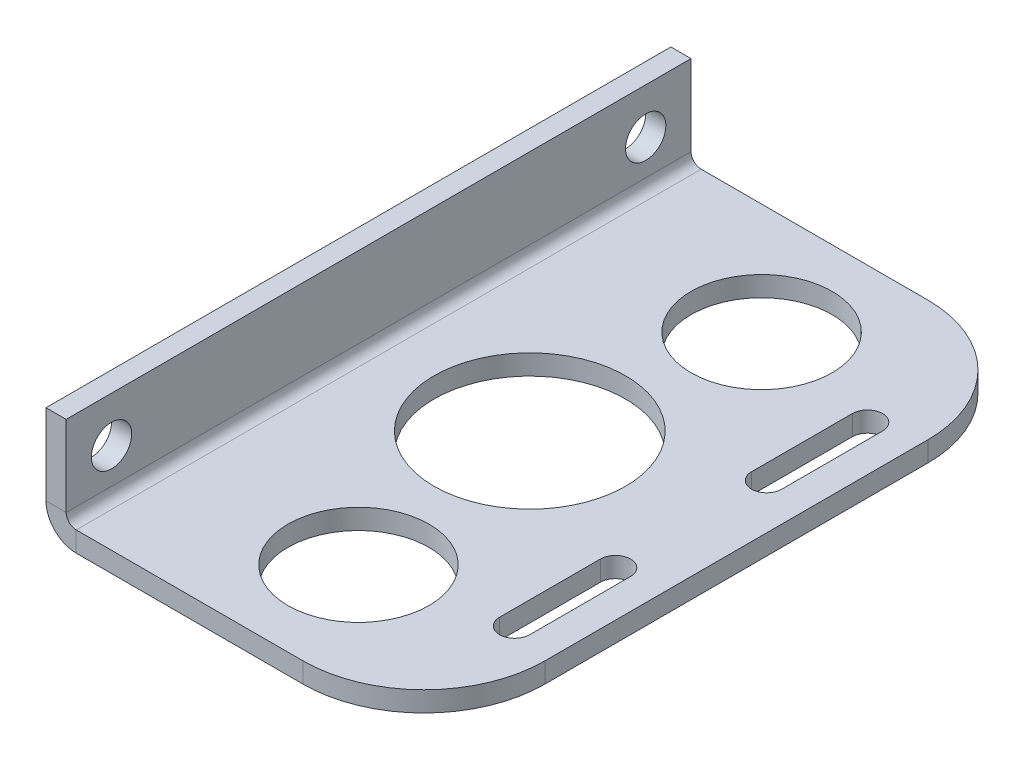
ISO-10303-21;
HEADER;
FILE_DESCRIPTION(('STEP AP214'),'2;1');
FILE_NAME('part.step','',(''),(''),'','','');
FILE_SCHEMA(('AUTOMOTIVE_DESIGN { 1 0 10303 214 1 1 1 1 }'));
ENDSEC;
DATA;
#1=APPLICATION_CONTEXT('core data for automotive mechanical design processes');
#2=APPLICATION_PROTOCOL_DEFINITION('international standard','automotive_design',2000,#1);
#3=PRODUCT_CONTEXT('',#1,'mechanical');
#4=PRODUCT('Part','Part','',(#3));
#5=PRODUCT_RELATED_PRODUCT_CATEGORY('part','',(#4));
#6=PRODUCT_DEFINITION_FORMATION('','',#4);
#7=PRODUCT_DEFINITION_CONTEXT('part definition',#1,'design');
#8=PRODUCT_DEFINITION('design','',#6,#7);
#9=PRODUCT_DEFINITION_SHAPE('','',#8);
#10=(LENGTH_UNIT() NAMED_UNIT(*) SI_UNIT(.MILLI.,.METRE.));
#11=(NAMED_UNIT(*) PLANE_ANGLE_UNIT() SI_UNIT($,.RADIAN.));
#12=(NAMED_UNIT(*) SI_UNIT($,.STERADIAN.) SOLID_ANGLE_UNIT());
#13=UNCERTAINTY_MEASURE_WITH_UNIT(LENGTH_MEASURE(1.E-05),#10,'distance_accuracy_value','');
#14=(GEOMETRIC_REPRESENTATION_CONTEXT(3) GLOBAL_UNCERTAINTY_ASSIGNED_CONTEXT((#13)) GLOBAL_UNIT_ASSIGNED_CONTEXT((#10,
#11,#12)) REPRESENTATION_CONTEXT('',''));
#15=CARTESIAN_POINT('',(0.,0.,0.));
#16=DIRECTION('',(0.,0.,1.));
#17=DIRECTION('',(1.,0.,0.));
#18=AXIS2_PLACEMENT_3D('',#15,#16,#17);
#19=CARTESIAN_POINT('',(2.,11.,-31.));
#20=DIRECTION('',(0.,0.,1.));
#21=DIRECTION('',(0.,-1.,0.));
#22=AXIS2_PLACEMENT_3D('',#19,#20,#21);
#23=PLANE('',#22);
#24=DIRECTION('',(1.,0.,0.));
#25=VECTOR('',#24,1.);
#26=CARTESIAN_POINT('',(2.,3.,-31.));
#27=LINE('',#26,#25);
#28=CARTESIAN_POINT('',(0.,3.,-31.));
#29=VERTEX_POINT('',#28);
#30=CARTESIAN_POINT('',(2.,3.,-31.));
#31=VERTEX_POINT('',#30);
#32=EDGE_CURVE('E11',#29,#31,#27,.T.);
#33=ORIENTED_EDGE('',*,*,#32,.F.);
#34=DIRECTION('',(0.,1.,0.));
#35=VECTOR('',#34,1.);
#36=CARTESIAN_POINT('',(0.,11.,-31.));
#37=LINE('',#36,#35);
#38=CARTESIAN_POINT('',(0.,11.,-31.));
#39=VERTEX_POINT('',#38);
#40=EDGE_CURVE('E124',#39,#29,#37,.F.);
#41=ORIENTED_EDGE('',*,*,#40,.F.);
#42=DIRECTION('',(1.,0.,0.));
#43=VECTOR('',#42,1.);
#44=CARTESIAN_POINT('',(2.,11.,-31.));
#45=LINE('',#44,#43);
#46=CARTESIAN_POINT('',(2.,11.,-31.));
#47=VERTEX_POINT('',#46);
#48=EDGE_CURVE('E54',#39,#47,#45,.T.);
#49=ORIENTED_EDGE('',*,*,#48,.T.);
#50=DIRECTION('',(0.,-1.,0.));
#51=VECTOR('',#50,1.);
#52=CARTESIAN_POINT('',(2.,11.,-31.));
#53=LINE('',#52,#51);
#54=EDGE_CURVE('E127',#47,#31,#53,.T.);
#55=ORIENTED_EDGE('',*,*,#54,.T.);
#56=EDGE_LOOP('',(#33,#41,#49,#55));
#57=FACE_BOUND('',#56,.T.);
#58=ADVANCED_FACE('F43',(#57),#23,.F.);
#59=CARTESIAN_POINT('',(2.,11.,31.));
#60=DIRECTION('',(0.,-1.,0.));
#61=DIRECTION('',(0.,0.,-1.));
#62=AXIS2_PLACEMENT_3D('',#59,#60,#61);
#63=PLANE('',#62);
#64=ORIENTED_EDGE('',*,*,#48,.F.);
#65=DIRECTION('',(0.,0.,1.));
#66=VECTOR('',#65,1.);
#67=CARTESIAN_POINT('',(0.,11.,31.));
#68=LINE('',#67,#66);
#69=CARTESIAN_POINT('',(0.,11.,31.));
#70=VERTEX_POINT('',#69);
#71=EDGE_CURVE('E153',#70,#39,#68,.F.);
#72=ORIENTED_EDGE('',*,*,#71,.F.);
#73=DIRECTION('',(1.,0.,0.));
#74=VECTOR('',#73,1.);
#75=CARTESIAN_POINT('',(2.,11.,31.));
#76=LINE('',#75,#74);
#77=CARTESIAN_POINT('',(2.,11.,31.));
#78=VERTEX_POINT('',#77);
#79=EDGE_CURVE('E228',#70,#78,#76,.T.);
#80=ORIENTED_EDGE('',*,*,#79,.T.);
#81=DIRECTION('',(0.,0.,-1.));
#82=VECTOR('',#81,1.);
#83=CARTESIAN_POINT('',(2.,11.,31.));
#84=LINE('',#83,#82);
#85=EDGE_CURVE('E241',#78,#47,#84,.T.);
#86=ORIENTED_EDGE('',*,*,#85,.T.);
#87=EDGE_LOOP('',(#64,#72,#80,#86));
#88=FACE_BOUND('',#87,.T.);
#89=ADVANCED_FACE('F248',(#88),#63,.F.);
#90=CARTESIAN_POINT('',(2.,11.,31.));
#91=DIRECTION('',(0.,0.,1.));
#92=DIRECTION('',(0.,-1.,0.));
#93=AXIS2_PLACEMENT_3D('',#90,#91,#92);
#94=PLANE('',#93);
#95=ORIENTED_EDGE('',*,*,#79,.F.);
#96=DIRECTION('',(0.,1.,0.));
#97=VECTOR('',#96,1.);
#98=CARTESIAN_POINT('',(0.,11.,31.));
#99=LINE('',#98,#97);
#100=CARTESIAN_POINT('',(0.,3.,31.));
#101=VERTEX_POINT('',#100);
#102=EDGE_CURVE('E339',#70,#101,#99,.F.);
#103=ORIENTED_EDGE('',*,*,#102,.T.);
#104=DIRECTION('',(1.,0.,0.));
#105=VECTOR('',#104,1.);
#106=CARTESIAN_POINT('',(2.,3.,31.));
#107=LINE('',#106,#105);
#108=CARTESIAN_POINT('',(2.,3.,31.));
#109=VERTEX_POINT('',#108);
#110=EDGE_CURVE('E224',#101,#109,#107,.T.);
#111=ORIENTED_EDGE('',*,*,#110,.T.);
#112=DIRECTION('',(0.,-1.,0.));
#113=VECTOR('',#112,1.);
#114=CARTESIAN_POINT('',(2.,11.,31.));
#115=LINE('',#114,#113);
#116=EDGE_CURVE('E250',#78,#109,#115,.T.);
#117=ORIENTED_EDGE('',*,*,#116,.F.);
#118=EDGE_LOOP('',(#95,#103,#111,#117));
#119=FACE_BOUND('',#118,.T.);
#120=ADVANCED_FACE('F429',(#119),#94,.T.);
#121=CARTESIAN_POINT('',(3.,3.,31.));
#122=DIRECTION('',(0.,0.,1.));
#123=DIRECTION('',(1.,0.,0.));
#124=AXIS2_PLACEMENT_3D('',#121,#122,#123);
#125=PLANE('',#124);
#126=ORIENTED_EDGE('',*,*,#110,.F.);
#127=CARTESIAN_POINT('',(3.,3.,31.));
#128=DIRECTION('',(0.,0.,1.));
#129=DIRECTION('',(1.,0.,0.));
#130=AXIS2_PLACEMENT_3D('',#127,#128,#129);
#131=CIRCLE('',#130,3.);
#132=CARTESIAN_POINT('',(3.,0.,31.));
#133=VERTEX_POINT('',#132);
#134=EDGE_CURVE('E142',#101,#133,#131,.T.);
#135=ORIENTED_EDGE('',*,*,#134,.T.);
#136=DIRECTION('',(0.,1.,0.));
#137=VECTOR('',#136,1.);
#138=CARTESIAN_POINT('',(3.,2.,31.));
#139=LINE('',#138,#137);
#140=CARTESIAN_POINT('',(3.,2.,31.));
#141=VERTEX_POINT('',#140);
#142=EDGE_CURVE('E62',#133,#141,#139,.T.);
#143=ORIENTED_EDGE('',*,*,#142,.T.);
#144=CARTESIAN_POINT('',(3.,3.,31.));
#145=DIRECTION('',(0.,0.,-1.));
#146=DIRECTION('',(-1.,0.,0.));
#147=AXIS2_PLACEMENT_3D('',#144,#145,#146);
#148=CIRCLE('',#147,1.);
#149=EDGE_CURVE('E328',#109,#141,#148,.F.);
#150=ORIENTED_EDGE('',*,*,#149,.F.);
#151=EDGE_LOOP('',(#126,#135,#143,#150));
#152=FACE_BOUND('',#151,.T.);
#153=ADVANCED_FACE('F518',(#152),#125,.T.);
#154=CARTESIAN_POINT('',(0.,2.,31.));
#155=DIRECTION('',(0.,0.,1.));
#156=DIRECTION('',(1.,0.,0.));
#157=AXIS2_PLACEMENT_3D('',#154,#155,#156);
#158=PLANE('',#157);
#159=ORIENTED_EDGE('',*,*,#142,.F.);
#160=DIRECTION('',(1.,0.,0.));
#161=VECTOR('',#160,1.);
#162=CARTESIAN_POINT('',(0.,0.,31.));
#163=LINE('',#162,#161);
#164=CARTESIAN_POINT('',(25.5,0.,31.));
#165=VERTEX_POINT('',#164);
#166=EDGE_CURVE('E384',#133,#165,#163,.T.);
#167=ORIENTED_EDGE('',*,*,#166,.T.);
#168=DIRECTION('',(0.,1.,0.));
#169=VECTOR('',#168,1.);
#170=CARTESIAN_POINT('',(25.5,2.,31.));
#171=LINE('',#170,#169);
#172=CARTESIAN_POINT('',(25.5,2.,31.));
#173=VERTEX_POINT('',#172);
#174=EDGE_CURVE('E218',#165,#173,#171,.T.);
#175=ORIENTED_EDGE('',*,*,#174,.T.);
#176=DIRECTION('',(1.,0.,0.));
#177=VECTOR('',#176,1.);
#178=CARTESIAN_POINT('',(0.,2.,31.));
#179=LINE('',#178,#177);
#180=EDGE_CURVE('E312',#141,#173,#179,.T.);
#181=ORIENTED_EDGE('',*,*,#180,.F.);
#182=EDGE_LOOP('',(#159,#167,#175,#181));
#183=FACE_BOUND('',#182,.T.);
#184=ADVANCED_FACE('F514',(#183),#158,.T.);
#185=CARTESIAN_POINT('',(25.5,2.,19.));
#186=DIRECTION('',(0.,1.,0.));
#187=DIRECTION('',(0.,0.,1.));
#188=AXIS2_PLACEMENT_3D('',#185,#186,#187);
#189=CYLINDRICAL_SURFACE('',#188,12.);
#190=ORIENTED_EDGE('',*,*,#174,.F.);
#191=CARTESIAN_POINT('',(25.5,0.,19.));
#192=DIRECTION('',(0.,1.,0.));
#193=DIRECTION('',(0.,0.,1.));
#194=AXIS2_PLACEMENT_3D('',#191,#192,#193);
#195=CIRCLE('',#194,12.);
#196=CARTESIAN_POINT('',(37.5,0.,19.));
#197=VERTEX_POINT('',#196);
#198=EDGE_CURVE('E148',#165,#197,#195,.T.);
#199=ORIENTED_EDGE('',*,*,#198,.T.);
#200=DIRECTION('',(0.,1.,0.));
#201=VECTOR('',#200,1.);
#202=CARTESIAN_POINT('',(37.5,2.,19.));
#203=LINE('',#202,#201);
#204=CARTESIAN_POINT('',(37.5,2.,19.));
#205=VERTEX_POINT('',#204);
#206=EDGE_CURVE('E214',#197,#205,#203,.T.);
#207=ORIENTED_EDGE('',*,*,#206,.T.);
#208=CARTESIAN_POINT('',(25.5,2.,19.));
#209=DIRECTION('',(0.,1.,0.));
#210=DIRECTION('',(0.,0.,1.));
#211=AXIS2_PLACEMENT_3D('',#208,#209,#210);
#212=CIRCLE('',#211,12.);
#213=EDGE_CURVE('E316',#173,#205,#212,.T.);
#214=ORIENTED_EDGE('',*,*,#213,.F.);
#215=EDGE_LOOP('',(#190,#199,#207,#214));
#216=FACE_BOUND('',#215,.T.);
#217=ADVANCED_FACE('F510',(#216),#189,.T.);
#218=CARTESIAN_POINT('',(37.5,2.,31.));
#219=DIRECTION('',(1.,0.,0.));
#220=DIRECTION('',(0.,0.,-1.));
#221=AXIS2_PLACEMENT_3D('',#218,#219,#220);
#222=PLANE('',#221);
#223=ORIENTED_EDGE('',*,*,#206,.F.);
#224=DIRECTION('',(0.,0.,1.));
#225=VECTOR('',#224,1.);
#226=CARTESIAN_POINT('',(37.5,0.,31.));
#227=LINE('',#226,#225);
#228=CARTESIAN_POINT('',(37.5,0.,-19.));
#229=VERTEX_POINT('',#228);
#230=EDGE_CURVE('E372',#197,#229,#227,.F.);
#231=ORIENTED_EDGE('',*,*,#230,.T.);
#232=DIRECTION('',(0.,1.,0.));
#233=VECTOR('',#232,1.);
#234=CARTESIAN_POINT('',(37.5,2.,-19.));
#235=LINE('',#234,#233);
#236=CARTESIAN_POINT('',(37.5,2.,-19.));
#237=VERTEX_POINT('',#236);
#238=EDGE_CURVE('E210',#229,#237,#235,.T.);
#239=ORIENTED_EDGE('',*,*,#238,.T.);
#240=DIRECTION('',(0.,0.,-1.));
#241=VECTOR('',#240,1.);
#242=CARTESIAN_POINT('',(37.5,2.,31.));
#243=LINE('',#242,#241);
#244=EDGE_CURVE('E300',#205,#237,#243,.T.);
#245=ORIENTED_EDGE('',*,*,#244,.F.);
#246=EDGE_LOOP('',(#223,#231,#239,#245));
#247=FACE_BOUND('',#246,.T.);
#248=ADVANCED_FACE('F506',(#247),#222,.T.);
#249=CARTESIAN_POINT('',(25.5,2.,-19.));
#250=DIRECTION('',(0.,1.,0.));
#251=DIRECTION('',(0.,0.,1.));
#252=AXIS2_PLACEMENT_3D('',#249,#250,#251);
#253=CYLINDRICAL_SURFACE('',#252,12.);
#254=ORIENTED_EDGE('',*,*,#238,.F.);
#255=CARTESIAN_POINT('',(25.5,0.,-19.));
#256=DIRECTION('',(0.,1.,0.));
#257=DIRECTION('',(0.,0.,1.));
#258=AXIS2_PLACEMENT_3D('',#255,#256,#257);
#259=CIRCLE('',#258,12.);
#260=CARTESIAN_POINT('',(25.5,0.,-31.));
#261=VERTEX_POINT('',#260);
#262=EDGE_CURVE('E385',#229,#261,#259,.T.);
#263=ORIENTED_EDGE('',*,*,#262,.T.);
#264=DIRECTION('',(0.,1.,0.));
#265=VECTOR('',#264,1.);
#266=CARTESIAN_POINT('',(25.5,2.,-31.));
#267=LINE('',#266,#265);
#268=CARTESIAN_POINT('',(25.5,2.,-31.));
#269=VERTEX_POINT('',#268);
#270=EDGE_CURVE('E206',#261,#269,#267,.T.);
#271=ORIENTED_EDGE('',*,*,#270,.T.);
#272=CARTESIAN_POINT('',(25.5,2.,-19.));
#273=DIRECTION('',(0.,1.,0.));
#274=DIRECTION('',(0.,0.,1.));
#275=AXIS2_PLACEMENT_3D('',#272,#273,#274);
#276=CIRCLE('',#275,12.);
#277=EDGE_CURVE('E304',#237,#269,#276,.T.);
#278=ORIENTED_EDGE('',*,*,#277,.F.);
#279=EDGE_LOOP('',(#254,#263,#271,#278));
#280=FACE_BOUND('',#279,.T.);
#281=ADVANCED_FACE('F502',(#280),#253,.T.);
#282=CARTESIAN_POINT('',(0.,2.,-31.));
#283=DIRECTION('',(0.,0.,1.));
#284=DIRECTION('',(1.,0.,0.));
#285=AXIS2_PLACEMENT_3D('',#282,#283,#284);
#286=PLANE('',#285);
#287=ORIENTED_EDGE('',*,*,#270,.F.);
#288=DIRECTION('',(1.,0.,0.));
#289=VECTOR('',#288,1.);
#290=CARTESIAN_POINT('',(0.,0.,-31.));
#291=LINE('',#290,#289);
#292=CARTESIAN_POINT('',(3.,0.,-31.));
#293=VERTEX_POINT('',#292);
#294=EDGE_CURVE('E380',#293,#261,#291,.T.);
#295=ORIENTED_EDGE('',*,*,#294,.F.);
#296=DIRECTION('',(0.,1.,0.));
#297=VECTOR('',#296,1.);
#298=CARTESIAN_POINT('',(3.,2.,-31.));
#299=LINE('',#298,#297);
#300=CARTESIAN_POINT('',(3.,2.,-31.));
#301=VERTEX_POINT('',#300);
#302=EDGE_CURVE('E47',#293,#301,#299,.T.);
#303=ORIENTED_EDGE('',*,*,#302,.T.);
#304=DIRECTION('',(1.,0.,0.));
#305=VECTOR('',#304,1.);
#306=CARTESIAN_POINT('',(0.,2.,-31.));
#307=LINE('',#306,#305);
#308=EDGE_CURVE('E308',#301,#269,#307,.T.);
#309=ORIENTED_EDGE('',*,*,#308,.T.);
#310=EDGE_LOOP('',(#287,#295,#303,#309));
#311=FACE_BOUND('',#310,.T.);
#312=ADVANCED_FACE('F495',(#311),#286,.F.);
#313=CARTESIAN_POINT('',(33.,2.,17.4999999999998));
#314=DIRECTION('',(0.,1.,0.));
#315=DIRECTION('',(0.,0.,1.));
#316=AXIS2_PLACEMENT_3D('',#313,#314,#315);
#317=CYLINDRICAL_SURFACE('',#316,1.5);
#318=DIRECTION('',(0.,1.,0.));
#319=VECTOR('',#318,1.);
#320=CARTESIAN_POINT('',(34.5,2.,17.4999999999998));
#321=LINE('',#320,#319);
#322=CARTESIAN_POINT('',(34.5,0.,17.4999999999998));
#323=VERTEX_POINT('',#322);
#324=CARTESIAN_POINT('',(34.5,2.,17.4999999999998));
#325=VERTEX_POINT('',#324);
#326=EDGE_CURVE('E199',#323,#325,#321,.T.);
#327=ORIENTED_EDGE('',*,*,#326,.F.);
#328=CARTESIAN_POINT('',(33.,0.,17.4999999999998));
#329=DIRECTION('',(0.,1.,0.));
#330=DIRECTION('',(0.,0.,1.));
#331=AXIS2_PLACEMENT_3D('',#328,#329,#330);
#332=CIRCLE('',#331,1.5);
#333=CARTESIAN_POINT('',(31.5,0.,17.4999999999998));
#334=VERTEX_POINT('',#333);
#335=EDGE_CURVE('E373',#334,#323,#332,.T.);
#336=ORIENTED_EDGE('',*,*,#335,.F.);
#337=DIRECTION('',(0.,1.,0.));
#338=VECTOR('',#337,1.);
#339=CARTESIAN_POINT('',(31.5,2.,17.4999999999998));
#340=LINE('',#339,#338);
#341=CARTESIAN_POINT('',(31.5,2.,17.4999999999998));
#342=VERTEX_POINT('',#341);
#343=EDGE_CURVE('E195',#334,#342,#340,.T.);
#344=ORIENTED_EDGE('',*,*,#343,.T.);
#345=CARTESIAN_POINT('',(33.,2.,17.4999999999998));
#346=DIRECTION('',(0.,1.,0.));
#347=DIRECTION('',(0.,0.,1.));
#348=AXIS2_PLACEMENT_3D('',#345,#346,#347);
#349=CIRCLE('',#348,1.5);
#350=EDGE_CURVE('E292',#342,#325,#349,.T.);
#351=ORIENTED_EDGE('',*,*,#350,.T.);
#352=EDGE_LOOP('',(#327,#336,#344,#351));
#353=FACE_BOUND('',#352,.T.);
#354=ADVANCED_FACE('F491',(#353),#317,.F.);
#355=CARTESIAN_POINT('',(31.5,2.,7.49999999999979));
#356=DIRECTION('',(-1.,0.,0.));
#357=DIRECTION('',(0.,0.,1.));
#358=AXIS2_PLACEMENT_3D('',#355,#356,#357);
#359=PLANE('',#358);
#360=ORIENTED_EDGE('',*,*,#343,.F.);
#361=DIRECTION('',(0.,0.,1.));
#362=VECTOR('',#361,1.);
#363=CARTESIAN_POINT('',(31.5,0.,31.));
#364=LINE('',#363,#362);
#365=CARTESIAN_POINT('',(31.5,0.,7.49999999999979));
#366=VERTEX_POINT('',#365);
#367=EDGE_CURVE('E368',#366,#334,#364,.T.);
#368=ORIENTED_EDGE('',*,*,#367,.F.);
#369=DIRECTION('',(0.,1.,0.));
#370=VECTOR('',#369,1.);
#371=CARTESIAN_POINT('',(31.5,2.,7.49999999999979));
#372=LINE('',#371,#370);
#373=CARTESIAN_POINT('',(31.5,2.,7.49999999999979));
#374=VERTEX_POINT('',#373);
#375=EDGE_CURVE('E191',#366,#374,#372,.T.);
#376=ORIENTED_EDGE('',*,*,#375,.T.);
#377=DIRECTION('',(0.,0.,1.));
#378=VECTOR('',#377,1.);
#379=CARTESIAN_POINT('',(31.5,2.,7.49999999999979));
#380=LINE('',#379,#378);
#381=EDGE_CURVE('E296',#374,#342,#380,.T.);
#382=ORIENTED_EDGE('',*,*,#381,.T.);
#383=EDGE_LOOP('',(#360,#368,#376,#382));
#384=FACE_BOUND('',#383,.T.);
#385=ADVANCED_FACE('F487',(#384),#359,.F.);
#386=CARTESIAN_POINT('',(33.,2.,7.49999999999979));
#387=DIRECTION('',(0.,1.,0.));
#388=DIRECTION('',(0.,0.,1.));
#389=AXIS2_PLACEMENT_3D('',#386,#387,#388);
#390=CYLINDRICAL_SURFACE('',#389,1.5);
#391=ORIENTED_EDGE('',*,*,#375,.F.);
#392=CARTESIAN_POINT('',(33.,0.,7.49999999999979));
#393=DIRECTION('',(0.,1.,0.));
#394=DIRECTION('',(0.,0.,1.));
#395=AXIS2_PLACEMENT_3D('',#392,#393,#394);
#396=CIRCLE('',#395,1.5);
#397=CARTESIAN_POINT('',(34.5,0.,7.49999999999979));
#398=VERTEX_POINT('',#397);
#399=EDGE_CURVE('E363',#398,#366,#396,.T.);
#400=ORIENTED_EDGE('',*,*,#399,.F.);
#401=DIRECTION('',(0.,1.,0.));
#402=VECTOR('',#401,1.);
#403=CARTESIAN_POINT('',(34.5,2.,7.49999999999979));
#404=LINE('',#403,#402);
#405=CARTESIAN_POINT('',(34.5,2.,7.49999999999979));
#406=VERTEX_POINT('',#405);
#407=EDGE_CURVE('E186',#398,#406,#404,.T.);
#408=ORIENTED_EDGE('',*,*,#407,.T.);
#409=CARTESIAN_POINT('',(33.,2.,7.49999999999979));
#410=DIRECTION('',(0.,1.,0.));
#411=DIRECTION('',(0.,0.,1.));
#412=AXIS2_PLACEMENT_3D('',#409,#410,#411);
#413=CIRCLE('',#412,1.5);
#414=EDGE_CURVE('E284',#406,#374,#413,.T.);
#415=ORIENTED_EDGE('',*,*,#414,.T.);
#416=EDGE_LOOP('',(#391,#400,#408,#415));
#417=FACE_BOUND('',#416,.T.);
#418=ADVANCED_FACE('F468',(#417),#390,.F.);
#419=CARTESIAN_POINT('',(33.,2.,-17.4999999999998));
#420=DIRECTION('',(0.,1.,0.));
#421=DIRECTION('',(0.,0.,1.));
#422=AXIS2_PLACEMENT_3D('',#419,#420,#421);
#423=CYLINDRICAL_SURFACE('',#422,1.5);
#424=DIRECTION('',(0.,1.,0.));
#425=VECTOR('',#424,1.);
#426=CARTESIAN_POINT('',(31.5,2.,-17.4999999999998));
#427=LINE('',#426,#425);
#428=CARTESIAN_POINT('',(31.5,0.,-17.4999999999998));
#429=VERTEX_POINT('',#428);
#430=CARTESIAN_POINT('',(31.5,2.,-17.4999999999998));
#431=VERTEX_POINT('',#430);
#432=EDGE_CURVE('E182',#429,#431,#427,.T.);
#433=ORIENTED_EDGE('',*,*,#432,.F.);
#434=CARTESIAN_POINT('',(33.,0.,-17.4999999999998));
#435=DIRECTION('',(0.,1.,0.));
#436=DIRECTION('',(0.,0.,1.));
#437=AXIS2_PLACEMENT_3D('',#434,#435,#436);
#438=CIRCLE('',#437,1.5);
#439=CARTESIAN_POINT('',(34.5,0.,-17.4999999999998));
#440=VERTEX_POINT('',#439);
#441=EDGE_CURVE('E345',#440,#429,#438,.T.);
#442=ORIENTED_EDGE('',*,*,#441,.F.);
#443=DIRECTION('',(0.,1.,0.));
#444=VECTOR('',#443,1.);
#445=CARTESIAN_POINT('',(34.5,2.,-17.4999999999998));
#446=LINE('',#445,#444);
#447=CARTESIAN_POINT('',(34.5,2.,-17.4999999999998));
#448=VERTEX_POINT('',#447);
#449=EDGE_CURVE('E177',#440,#448,#446,.T.);
#450=ORIENTED_EDGE('',*,*,#449,.T.);
#451=CARTESIAN_POINT('',(33.,2.,-17.4999999999998));
#452=DIRECTION('',(0.,1.,0.));
#453=DIRECTION('',(0.,0.,-1.));
#454=AXIS2_PLACEMENT_3D('',#451,#452,#453);
#455=CIRCLE('',#454,1.5);
#456=EDGE_CURVE('E264',#448,#431,#455,.T.);
#457=ORIENTED_EDGE('',*,*,#456,.T.);
#458=EDGE_LOOP('',(#433,#442,#450,#457));
#459=FACE_BOUND('',#458,.T.);
#460=ADVANCED_FACE('F464',(#459),#423,.F.);
#461=CARTESIAN_POINT('',(34.5,2.,-7.49999999999979));
#462=DIRECTION('',(1.,0.,0.));
#463=DIRECTION('',(0.,0.,-1.));
#464=AXIS2_PLACEMENT_3D('',#461,#462,#463);
#465=PLANE('',#464);
#466=ORIENTED_EDGE('',*,*,#449,.F.);
#467=DIRECTION('',(0.,0.,1.));
#468=VECTOR('',#467,1.);
#469=CARTESIAN_POINT('',(34.5,0.,31.));
#470=LINE('',#469,#468);
#471=CARTESIAN_POINT('',(34.5,0.,-7.49999999999979));
#472=VERTEX_POINT('',#471);
#473=EDGE_CURVE('E340',#472,#440,#470,.F.);
#474=ORIENTED_EDGE('',*,*,#473,.F.);
#475=DIRECTION('',(0.,1.,0.));
#476=VECTOR('',#475,1.);
#477=CARTESIAN_POINT('',(34.5,2.,-7.49999999999979));
#478=LINE('',#477,#476);
#479=CARTESIAN_POINT('',(34.5,2.,-7.49999999999979));
#480=VERTEX_POINT('',#479);
#481=EDGE_CURVE('E173',#472,#480,#478,.T.);
#482=ORIENTED_EDGE('',*,*,#481,.T.);
#483=DIRECTION('',(0.,0.,-1.));
#484=VECTOR('',#483,1.);
#485=CARTESIAN_POINT('',(34.5,2.,-7.49999999999979));
#486=LINE('',#485,#484);
#487=EDGE_CURVE('E268',#480,#448,#486,.T.);
#488=ORIENTED_EDGE('',*,*,#487,.T.);
#489=EDGE_LOOP('',(#466,#474,#482,#488));
#490=FACE_BOUND('',#489,.T.);
#491=ADVANCED_FACE('F444',(#490),#465,.F.);
#492=CARTESIAN_POINT('',(33.,2.,-7.49999999999979));
#493=DIRECTION('',(0.,1.,0.));
#494=DIRECTION('',(0.,0.,1.));
#495=AXIS2_PLACEMENT_3D('',#492,#493,#494);
#496=CYLINDRICAL_SURFACE('',#495,1.5);
#497=ORIENTED_EDGE('',*,*,#481,.F.);
#498=CARTESIAN_POINT('',(33.,0.,-7.49999999999979));
#499=DIRECTION('',(0.,1.,0.));
#500=DIRECTION('',(0.,0.,1.));
#501=AXIS2_PLACEMENT_3D('',#498,#499,#500);
#502=CIRCLE('',#501,1.5);
#503=CARTESIAN_POINT('',(31.5,0.,-7.49999999999979));
#504=VERTEX_POINT('',#503);
#505=EDGE_CURVE('E334',#504,#472,#502,.T.);
#506=ORIENTED_EDGE('',*,*,#505,.F.);
#507=DIRECTION('',(0.,1.,0.));
#508=VECTOR('',#507,1.);
#509=CARTESIAN_POINT('',(31.5,2.,-7.49999999999979));
#510=LINE('',#509,#508);
#511=CARTESIAN_POINT('',(31.5,2.,-7.49999999999979));
#512=VERTEX_POINT('',#511);
#513=EDGE_CURVE('E178',#504,#512,#510,.T.);
#514=ORIENTED_EDGE('',*,*,#513,.T.);
#515=CARTESIAN_POINT('',(33.,2.,-7.49999999999979));
#516=DIRECTION('',(0.,1.,0.));
#517=DIRECTION('',(0.,0.,-1.));
#518=AXIS2_PLACEMENT_3D('',#515,#516,#517);
#519=CIRCLE('',#518,1.5);
#520=EDGE_CURVE('E253',#512,#480,#519,.T.);
#521=ORIENTED_EDGE('',*,*,#520,.T.);
#522=EDGE_LOOP('',(#497,#506,#514,#521));
#523=FACE_BOUND('',#522,.T.);
#524=ADVANCED_FACE('F437',(#523),#496,.F.);
#525=CARTESIAN_POINT('',(2.,6.5,26.5));
#526=DIRECTION('',(1.,0.,0.));
#527=DIRECTION('',(0.,1.,0.));
#528=AXIS2_PLACEMENT_3D('',#525,#526,#527);
#529=CYLINDRICAL_SURFACE('',#528,2.);
#530=CARTESIAN_POINT('',(2.,6.5,26.5));
#531=DIRECTION('',(1.,0.,0.));
#532=DIRECTION('',(0.,1.,0.));
#533=AXIS2_PLACEMENT_3D('',#530,#531,#532);
#534=CIRCLE('',#533,2.);
#535=CARTESIAN_POINT('',(2.,8.5,26.5));
#536=VERTEX_POINT('',#535);
#537=EDGE_CURVE('E331',#536,#536,#534,.T.);
#538=ORIENTED_EDGE('',*,*,#537,.T.);
#539=EDGE_LOOP('',(#538));
#540=FACE_BOUND('',#539,.T.);
#541=CARTESIAN_POINT('',(0.,6.5,26.5));
#542=DIRECTION('',(1.,0.,0.));
#543=DIRECTION('',(0.,1.,0.));
#544=AXIS2_PLACEMENT_3D('',#541,#542,#543);
#545=CIRCLE('',#544,2.);
#546=CARTESIAN_POINT('',(0.,8.5,26.5));
#547=VERTEX_POINT('',#546);
#548=EDGE_CURVE('E163',#547,#547,#545,.T.);
#549=ORIENTED_EDGE('',*,*,#548,.F.);
#550=EDGE_LOOP('',(#549));
#551=FACE_BOUND('',#550,.T.);
#552=ADVANCED_FACE('F435',(#540,#551),#529,.F.);
#553=CARTESIAN_POINT('',(2.,6.5,-26.5));
#554=DIRECTION('',(1.,0.,0.));
#555=DIRECTION('',(0.,1.,0.));
#556=AXIS2_PLACEMENT_3D('',#553,#554,#555);
#557=CYLINDRICAL_SURFACE('',#556,2.);
#558=CARTESIAN_POINT('',(2.,6.5,-26.5));
#559=DIRECTION('',(1.,0.,0.));
#560=DIRECTION('',(0.,-1.,0.));
#561=AXIS2_PLACEMENT_3D('',#558,#559,#560);
#562=CIRCLE('',#561,2.);
#563=CARTESIAN_POINT('',(2.,4.5,-26.5));
#564=VERTEX_POINT('',#563);
#565=EDGE_CURVE('E246',#564,#564,#562,.T.);
#566=ORIENTED_EDGE('',*,*,#565,.T.);
#567=EDGE_LOOP('',(#566));
#568=FACE_BOUND('',#567,.T.);
#569=CARTESIAN_POINT('',(0.,6.5,-26.5));
#570=DIRECTION('',(1.,0.,0.));
#571=DIRECTION('',(0.,1.,0.));
#572=AXIS2_PLACEMENT_3D('',#569,#570,#571);
#573=CIRCLE('',#572,2.);
#574=CARTESIAN_POINT('',(0.,8.5,-26.5));
#575=VERTEX_POINT('',#574);
#576=EDGE_CURVE('E155',#575,#575,#573,.T.);
#577=ORIENTED_EDGE('',*,*,#576,.F.);
#578=EDGE_LOOP('',(#577));
#579=FACE_BOUND('',#578,.T.);
#580=ADVANCED_FACE('F45',(#568,#579),#557,.F.);
#581=CARTESIAN_POINT('',(31.5,2.,-7.49999999999979));
#582=DIRECTION('',(-1.,0.,0.));
#583=DIRECTION('',(0.,0.,1.));
#584=AXIS2_PLACEMENT_3D('',#581,#582,#583);
#585=PLANE('',#584);
#586=DIRECTION('',(0.,0.,1.));
#587=VECTOR('',#586,1.);
#588=CARTESIAN_POINT('',(31.5,0.,31.));
#589=LINE('',#588,#587);
#590=EDGE_CURVE('E338',#429,#504,#589,.T.);
#591=ORIENTED_EDGE('',*,*,#590,.F.);
#592=ORIENTED_EDGE('',*,*,#432,.T.);
#593=DIRECTION('',(0.,0.,1.));
#594=VECTOR('',#593,1.);
#595=CARTESIAN_POINT('',(31.5,2.,-7.49999999999979));
#596=LINE('',#595,#594);
#597=EDGE_CURVE('E260',#431,#512,#596,.T.);
#598=ORIENTED_EDGE('',*,*,#597,.T.);
#599=ORIENTED_EDGE('',*,*,#513,.F.);
#600=EDGE_LOOP('',(#591,#592,#598,#599));
#601=FACE_BOUND('',#600,.T.);
#602=ADVANCED_FACE('F443',(#601),#585,.F.);
#603=CARTESIAN_POINT('',(17.,2.,0.));
#604=DIRECTION('',(0.,1.,0.));
#605=DIRECTION('',(0.,0.,1.));
#606=AXIS2_PLACEMENT_3D('',#603,#604,#605);
#607=CYLINDRICAL_SURFACE('',#606,9.5);
#608=CARTESIAN_POINT('',(17.,2.,0.));
#609=DIRECTION('',(0.,1.,0.));
#610=DIRECTION('',(0.,0.,1.));
#611=AXIS2_PLACEMENT_3D('',#608,#609,#610);
#612=CIRCLE('',#611,9.5);
#613=CARTESIAN_POINT('',(17.,2.,9.5));
#614=VERTEX_POINT('',#613);
#615=EDGE_CURVE('E272',#614,#614,#612,.T.);
#616=ORIENTED_EDGE('',*,*,#615,.T.);
#617=EDGE_LOOP('',(#616));
#618=FACE_BOUND('',#617,.T.);
#619=CARTESIAN_POINT('',(17.,0.,0.));
#620=DIRECTION('',(0.,1.,0.));
#621=DIRECTION('',(0.,0.,1.));
#622=AXIS2_PLACEMENT_3D('',#619,#620,#621);
#623=CIRCLE('',#622,9.5);
#624=CARTESIAN_POINT('',(17.,0.,9.5));
#625=VERTEX_POINT('',#624);
#626=EDGE_CURVE('E344',#625,#625,#623,.T.);
#627=ORIENTED_EDGE('',*,*,#626,.F.);
#628=EDGE_LOOP('',(#627));
#629=FACE_BOUND('',#628,.T.);
#630=ADVANCED_FACE('F472',(#618,#629),#607,.F.);
#631=CARTESIAN_POINT('',(20.,2.,-20.));
#632=DIRECTION('',(0.,1.,0.));
#633=DIRECTION('',(0.,0.,1.));
#634=AXIS2_PLACEMENT_3D('',#631,#632,#633);
#635=CYLINDRICAL_SURFACE('',#634,7.);
#636=CARTESIAN_POINT('',(20.,2.,-20.));
#637=DIRECTION('',(0.,1.,0.));
#638=DIRECTION('',(0.,0.,1.));
#639=AXIS2_PLACEMENT_3D('',#636,#637,#638);
#640=CIRCLE('',#639,7.);
#641=CARTESIAN_POINT('',(20.,2.,-13.));
#642=VERTEX_POINT('',#641);
#643=EDGE_CURVE('E276',#642,#642,#640,.T.);
#644=ORIENTED_EDGE('',*,*,#643,.T.);
#645=EDGE_LOOP('',(#644));
#646=FACE_BOUND('',#645,.T.);
#647=CARTESIAN_POINT('',(20.,0.,-20.));
#648=DIRECTION('',(0.,1.,0.));
#649=DIRECTION('',(0.,0.,1.));
#650=AXIS2_PLACEMENT_3D('',#647,#648,#649);
#651=CIRCLE('',#650,7.);
#652=CARTESIAN_POINT('',(20.,0.,-13.));
#653=VERTEX_POINT('',#652);
#654=EDGE_CURVE('E355',#653,#653,#651,.T.);
#655=ORIENTED_EDGE('',*,*,#654,.F.);
#656=EDGE_LOOP('',(#655));
#657=FACE_BOUND('',#656,.T.);
#658=ADVANCED_FACE('F476',(#646,#657),#635,.F.);
#659=CARTESIAN_POINT('',(20.,2.,20.));
#660=DIRECTION('',(0.,1.,0.));
#661=DIRECTION('',(0.,0.,1.));
#662=AXIS2_PLACEMENT_3D('',#659,#660,#661);
#663=CYLINDRICAL_SURFACE('',#662,7.);
#664=CARTESIAN_POINT('',(20.,2.,20.));
#665=DIRECTION('',(0.,1.,0.));
#666=DIRECTION('',(0.,0.,-1.));
#667=AXIS2_PLACEMENT_3D('',#664,#665,#666);
#668=CIRCLE('',#667,7.);
#669=CARTESIAN_POINT('',(20.,2.,13.));
#670=VERTEX_POINT('',#669);
#671=EDGE_CURVE('E280',#670,#670,#668,.T.);
#672=ORIENTED_EDGE('',*,*,#671,.T.);
#673=EDGE_LOOP('',(#672));
#674=FACE_BOUND('',#673,.T.);
#675=CARTESIAN_POINT('',(20.,0.,20.));
#676=DIRECTION('',(0.,1.,0.));
#677=DIRECTION('',(0.,0.,1.));
#678=AXIS2_PLACEMENT_3D('',#675,#676,#677);
#679=CIRCLE('',#678,7.);
#680=CARTESIAN_POINT('',(20.,0.,27.));
#681=VERTEX_POINT('',#680);
#682=EDGE_CURVE('E359',#681,#681,#679,.T.);
#683=ORIENTED_EDGE('',*,*,#682,.F.);
#684=EDGE_LOOP('',(#683));
#685=FACE_BOUND('',#684,.T.);
#686=ADVANCED_FACE('F480',(#674,#685),#663,.F.);
#687=CARTESIAN_POINT('',(34.5,2.,7.49999999999979));
#688=DIRECTION('',(1.,0.,0.));
#689=DIRECTION('',(0.,0.,-1.));
#690=AXIS2_PLACEMENT_3D('',#687,#688,#689);
#691=PLANE('',#690);
#692=DIRECTION('',(0.,0.,1.));
#693=VECTOR('',#692,1.);
#694=CARTESIAN_POINT('',(34.5,0.,31.));
#695=LINE('',#694,#693);
#696=EDGE_CURVE('E367',#323,#398,#695,.F.);
#697=ORIENTED_EDGE('',*,*,#696,.F.);
#698=ORIENTED_EDGE('',*,*,#326,.T.);
#699=DIRECTION('',(0.,0.,-1.));
#700=VECTOR('',#699,1.);
#701=CARTESIAN_POINT('',(34.5,2.,7.49999999999979));
#702=LINE('',#701,#700);
#703=EDGE_CURVE('E288',#325,#406,#702,.T.);
#704=ORIENTED_EDGE('',*,*,#703,.T.);
#705=ORIENTED_EDGE('',*,*,#407,.F.);
#706=EDGE_LOOP('',(#697,#698,#704,#705));
#707=FACE_BOUND('',#706,.T.);
#708=ADVANCED_FACE('F434',(#707),#691,.F.);
#709=CARTESIAN_POINT('',(3.,3.,-31.));
#710=DIRECTION('',(0.,0.,-1.));
#711=DIRECTION('',(-1.,0.,0.));
#712=AXIS2_PLACEMENT_3D('',#709,#710,#711);
#713=PLANE('',#712);
#714=CARTESIAN_POINT('',(3.,3.,-31.));
#715=DIRECTION('',(0.,0.,1.));
#716=DIRECTION('',(1.,0.,0.));
#717=AXIS2_PLACEMENT_3D('',#714,#715,#716);
#718=CIRCLE('',#717,3.);
#719=EDGE_CURVE('E140',#293,#29,#718,.F.);
#720=ORIENTED_EDGE('',*,*,#719,.T.);
#721=ORIENTED_EDGE('',*,*,#32,.T.);
#722=CARTESIAN_POINT('',(3.,3.,-31.));
#723=DIRECTION('',(0.,0.,1.));
#724=DIRECTION('',(1.,0.,0.));
#725=AXIS2_PLACEMENT_3D('',#722,#723,#724);
#726=CIRCLE('',#725,1.);
#727=EDGE_CURVE('E325',#301,#31,#726,.F.);
#728=ORIENTED_EDGE('',*,*,#727,.F.);
#729=ORIENTED_EDGE('',*,*,#302,.F.);
#730=EDGE_LOOP('',(#720,#721,#728,#729));
#731=FACE_BOUND('',#730,.T.);
#732=ADVANCED_FACE('F158',(#731),#713,.T.);
#733=CARTESIAN_POINT('',(0.,2.,31.));
#734=DIRECTION('',(0.,1.,0.));
#735=DIRECTION('',(0.,0.,1.));
#736=AXIS2_PLACEMENT_3D('',#733,#734,#735);
#737=PLANE('',#736);
#738=ORIENTED_EDGE('',*,*,#520,.F.);
#739=ORIENTED_EDGE('',*,*,#597,.F.);
#740=ORIENTED_EDGE('',*,*,#456,.F.);
#741=ORIENTED_EDGE('',*,*,#487,.F.);
#742=EDGE_LOOP('',(#738,#739,#740,#741));
#743=FACE_BOUND('',#742,.T.);
#744=ORIENTED_EDGE('',*,*,#615,.F.);
#745=EDGE_LOOP('',(#744));
#746=FACE_BOUND('',#745,.T.);
#747=ORIENTED_EDGE('',*,*,#643,.F.);
#748=EDGE_LOOP('',(#747));
#749=FACE_BOUND('',#748,.T.);
#750=ORIENTED_EDGE('',*,*,#671,.F.);
#751=EDGE_LOOP('',(#750));
#752=FACE_BOUND('',#751,.T.);
#753=ORIENTED_EDGE('',*,*,#414,.F.);
#754=ORIENTED_EDGE('',*,*,#703,.F.);
#755=ORIENTED_EDGE('',*,*,#350,.F.);
#756=ORIENTED_EDGE('',*,*,#381,.F.);
#757=EDGE_LOOP('',(#753,#754,#755,#756));
#758=FACE_BOUND('',#757,.T.);
#759=ORIENTED_EDGE('',*,*,#308,.F.);
#760=DIRECTION('',(0.,0.,-1.));
#761=VECTOR('',#760,1.);
#762=CARTESIAN_POINT('',(3.,2.,31.));
#763=LINE('',#762,#761);
#764=EDGE_CURVE('E190',#301,#141,#763,.F.);
#765=ORIENTED_EDGE('',*,*,#764,.T.);
#766=ORIENTED_EDGE('',*,*,#180,.T.);
#767=ORIENTED_EDGE('',*,*,#213,.T.);
#768=ORIENTED_EDGE('',*,*,#244,.T.);
#769=ORIENTED_EDGE('',*,*,#277,.T.);
#770=EDGE_LOOP('',(#759,#765,#766,#767,#768,#769));
#771=FACE_BOUND('',#770,.T.);
#772=ADVANCED_FACE('F411',(#743,#746,#749,#752,#758,#771),#737,.T.);
#773=CARTESIAN_POINT('',(2.,11.,31.));
#774=DIRECTION('',(1.,0.,0.));
#775=DIRECTION('',(0.,1.,0.));
#776=AXIS2_PLACEMENT_3D('',#773,#774,#775);
#777=PLANE('',#776);
#778=ORIENTED_EDGE('',*,*,#537,.F.);
#779=EDGE_LOOP('',(#778));
#780=FACE_BOUND('',#779,.T.);
#781=ORIENTED_EDGE('',*,*,#565,.F.);
#782=EDGE_LOOP('',(#781));
#783=FACE_BOUND('',#782,.T.);
#784=ORIENTED_EDGE('',*,*,#116,.T.);
#785=DIRECTION('',(0.,0.,-1.));
#786=VECTOR('',#785,1.);
#787=CARTESIAN_POINT('',(2.,3.,-31.));
#788=LINE('',#787,#786);
#789=EDGE_CURVE('E244',#109,#31,#788,.T.);
#790=ORIENTED_EDGE('',*,*,#789,.T.);
#791=ORIENTED_EDGE('',*,*,#54,.F.);
#792=ORIENTED_EDGE('',*,*,#85,.F.);
#793=EDGE_LOOP('',(#784,#790,#791,#792));
#794=FACE_BOUND('',#793,.T.);
#795=ADVANCED_FACE('F240',(#780,#783,#794),#777,.T.);
#796=CARTESIAN_POINT('',(3.,3.,31.));
#797=DIRECTION('',(0.,0.,1.));
#798=DIRECTION('',(1.,0.,0.));
#799=AXIS2_PLACEMENT_3D('',#796,#797,#798);
#800=CYLINDRICAL_SURFACE('',#799,1.);
#801=ORIENTED_EDGE('',*,*,#149,.T.);
#802=ORIENTED_EDGE('',*,*,#764,.F.);
#803=ORIENTED_EDGE('',*,*,#727,.T.);
#804=ORIENTED_EDGE('',*,*,#789,.F.);
#805=EDGE_LOOP('',(#801,#802,#803,#804));
#806=FACE_BOUND('',#805,.T.);
#807=ADVANCED_FACE('F410',(#806),#800,.F.);
#808=CARTESIAN_POINT('',(0.,0.,31.));
#809=DIRECTION('',(0.,1.,0.));
#810=DIRECTION('',(0.,0.,1.));
#811=AXIS2_PLACEMENT_3D('',#808,#809,#810);
#812=PLANE('',#811);
#813=ORIENTED_EDGE('',*,*,#505,.T.);
#814=ORIENTED_EDGE('',*,*,#473,.T.);
#815=ORIENTED_EDGE('',*,*,#441,.T.);
#816=ORIENTED_EDGE('',*,*,#590,.T.);
#817=EDGE_LOOP('',(#813,#814,#815,#816));
#818=FACE_BOUND('',#817,.T.);
#819=ORIENTED_EDGE('',*,*,#626,.T.);
#820=EDGE_LOOP('',(#819));
#821=FACE_BOUND('',#820,.T.);
#822=ORIENTED_EDGE('',*,*,#654,.T.);
#823=EDGE_LOOP('',(#822));
#824=FACE_BOUND('',#823,.T.);
#825=ORIENTED_EDGE('',*,*,#682,.T.);
#826=EDGE_LOOP('',(#825));
#827=FACE_BOUND('',#826,.T.);
#828=ORIENTED_EDGE('',*,*,#399,.T.);
#829=ORIENTED_EDGE('',*,*,#367,.T.);
#830=ORIENTED_EDGE('',*,*,#335,.T.);
#831=ORIENTED_EDGE('',*,*,#696,.T.);
#832=EDGE_LOOP('',(#828,#829,#830,#831));
#833=FACE_BOUND('',#832,.T.);
#834=ORIENTED_EDGE('',*,*,#294,.T.);
#835=ORIENTED_EDGE('',*,*,#262,.F.);
#836=ORIENTED_EDGE('',*,*,#230,.F.);
#837=ORIENTED_EDGE('',*,*,#198,.F.);
#838=ORIENTED_EDGE('',*,*,#166,.F.);
#839=DIRECTION('',(0.,0.,1.));
#840=VECTOR('',#839,1.);
#841=CARTESIAN_POINT('',(3.,0.,31.));
#842=LINE('',#841,#840);
#843=EDGE_CURVE('E147',#293,#133,#842,.T.);
#844=ORIENTED_EDGE('',*,*,#843,.F.);
#845=EDGE_LOOP('',(#834,#835,#836,#837,#838,#844));
#846=FACE_BOUND('',#845,.T.);
#847=ADVANCED_FACE('F418',(#818,#821,#824,#827,#833,#846),#812,.F.);
#848=CARTESIAN_POINT('',(0.,11.,31.));
#849=DIRECTION('',(1.,0.,0.));
#850=DIRECTION('',(0.,1.,0.));
#851=AXIS2_PLACEMENT_3D('',#848,#849,#850);
#852=PLANE('',#851);
#853=ORIENTED_EDGE('',*,*,#548,.T.);
#854=EDGE_LOOP('',(#853));
#855=FACE_BOUND('',#854,.T.);
#856=ORIENTED_EDGE('',*,*,#576,.T.);
#857=EDGE_LOOP('',(#856));
#858=FACE_BOUND('',#857,.T.);
#859=ORIENTED_EDGE('',*,*,#102,.F.);
#860=ORIENTED_EDGE('',*,*,#71,.T.);
#861=ORIENTED_EDGE('',*,*,#40,.T.);
#862=DIRECTION('',(0.,0.,1.));
#863=VECTOR('',#862,1.);
#864=CARTESIAN_POINT('',(0.,3.,31.));
#865=LINE('',#864,#863);
#866=EDGE_CURVE('E137',#101,#29,#865,.F.);
#867=ORIENTED_EDGE('',*,*,#866,.F.);
#868=EDGE_LOOP('',(#859,#860,#861,#867));
#869=FACE_BOUND('',#868,.T.);
#870=ADVANCED_FACE('F151',(#855,#858,#869),#852,.F.);
#871=CARTESIAN_POINT('',(3.,3.,31.));
#872=DIRECTION('',(0.,0.,1.));
#873=DIRECTION('',(1.,0.,0.));
#874=AXIS2_PLACEMENT_3D('',#871,#872,#873);
#875=CYLINDRICAL_SURFACE('',#874,3.);
#876=ORIENTED_EDGE('',*,*,#134,.F.);
#877=ORIENTED_EDGE('',*,*,#866,.T.);
#878=ORIENTED_EDGE('',*,*,#719,.F.);
#879=ORIENTED_EDGE('',*,*,#843,.T.);
#880=EDGE_LOOP('',(#876,#877,#878,#879));
#881=FACE_BOUND('',#880,.T.);
#882=ADVANCED_FACE('F138',(#881),#875,.T.);
#883=CLOSED_SHELL('',(#58,#89,#120,#153,#184,#217,#248,#281,#312,#354,#385,#418,#460,#491,#524,
#552,#580,#602,#630,#658,#686,#708,#732,#772,#795,#807,#847,#870,#882));
#884=MANIFOLD_SOLID_BREP('B2',#883);
#885=ADVANCED_BREP_SHAPE_REPRESENTATION('',(#18,#884),#14);
#886=SHAPE_DEFINITION_REPRESENTATION(#9,#885);
ENDSEC;
END-ISO-10303-21;
